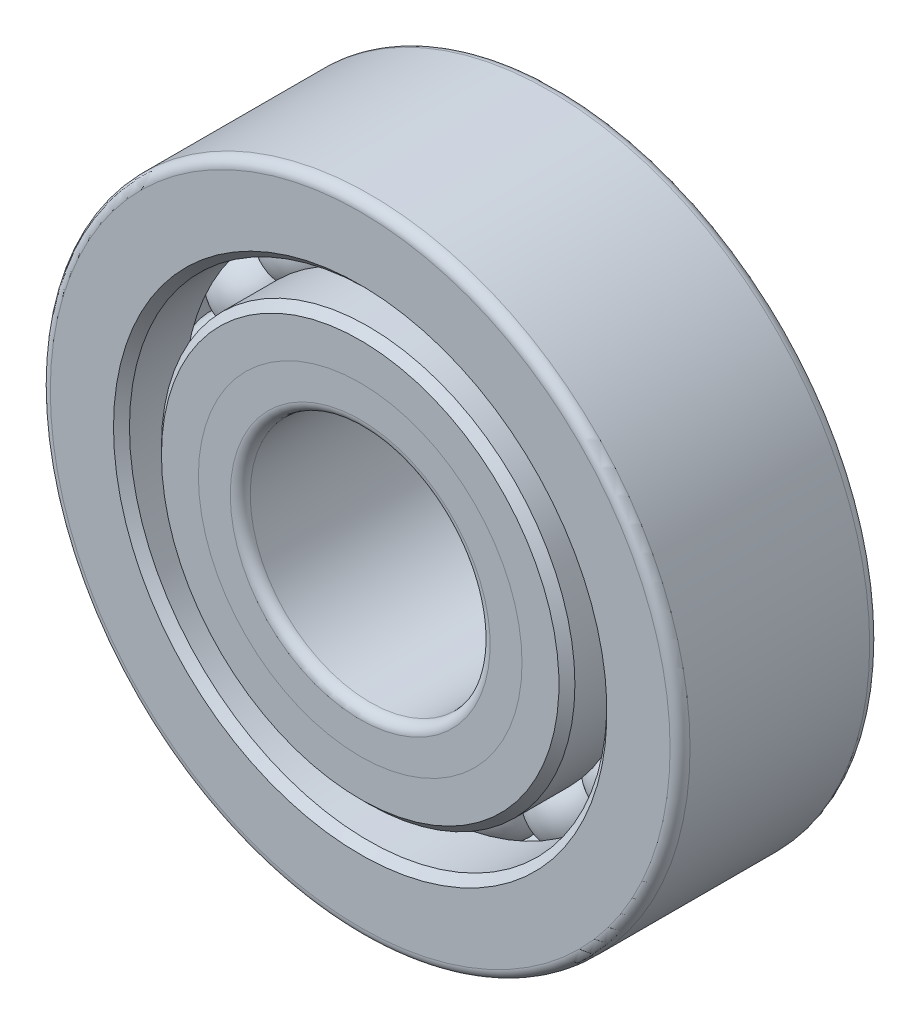
ISO-10303-21;
HEADER;
FILE_DESCRIPTION(('STEP AP214'),'2;1');
FILE_NAME('part.step','',(''),(''),'','','');
FILE_SCHEMA(('AUTOMOTIVE_DESIGN { 1 0 10303 214 1 1 1 1 }'));
ENDSEC;
DATA;
#1=APPLICATION_CONTEXT('core data for automotive mechanical design processes');
#2=APPLICATION_PROTOCOL_DEFINITION('international standard','automotive_design',2000,#1);
#3=PRODUCT_CONTEXT('',#1,'mechanical');
#4=PRODUCT('Part','Part','',(#3));
#5=PRODUCT_RELATED_PRODUCT_CATEGORY('part','',(#4));
#6=PRODUCT_DEFINITION_FORMATION('','',#4);
#7=PRODUCT_DEFINITION_CONTEXT('part definition',#1,'design');
#8=PRODUCT_DEFINITION('design','',#6,#7);
#9=PRODUCT_DEFINITION_SHAPE('','',#8);
#10=(LENGTH_UNIT() NAMED_UNIT(*) SI_UNIT(.MILLI.,.METRE.));
#11=(NAMED_UNIT(*) PLANE_ANGLE_UNIT() SI_UNIT($,.RADIAN.));
#12=(NAMED_UNIT(*) SI_UNIT($,.STERADIAN.) SOLID_ANGLE_UNIT());
#13=UNCERTAINTY_MEASURE_WITH_UNIT(LENGTH_MEASURE(1.E-05),#10,'distance_accuracy_value','');
#14=(GEOMETRIC_REPRESENTATION_CONTEXT(3) GLOBAL_UNCERTAINTY_ASSIGNED_CONTEXT((#13)) GLOBAL_UNIT_ASSIGNED_CONTEXT((#10,
#11,#12)) REPRESENTATION_CONTEXT('',''));
#15=CARTESIAN_POINT('',(0.,0.,0.));
#16=DIRECTION('',(0.,0.,1.));
#17=DIRECTION('',(1.,0.,0.));
#18=AXIS2_PLACEMENT_3D('',#15,#16,#17);
#19=CARTESIAN_POINT('',(0.,0.,-3.9724));
#20=DIRECTION('',(0.,0.,1.));
#21=DIRECTION('',(1.,0.,0.));
#22=AXIS2_PLACEMENT_3D('',#19,#20,#21);
#23=CYLINDRICAL_SURFACE('',#22,6.42450666666667);
#24=CARTESIAN_POINT('',(0.,0.,-3.9624));
#25=DIRECTION('',(0.,0.,1.));
#26=DIRECTION('',(1.,0.,0.));
#27=AXIS2_PLACEMENT_3D('',#24,#25,#26);
#28=CIRCLE('',#27,6.42450666666667);
#29=CARTESIAN_POINT('',(6.42450666666667,0.,-3.9624));
#30=VERTEX_POINT('',#29);
#31=EDGE_CURVE('E57',#30,#30,#28,.T.);
#32=ORIENTED_EDGE('',*,*,#31,.T.);
#33=EDGE_LOOP('',(#32));
#34=FACE_BOUND('',#33,.T.);
#35=CARTESIAN_POINT('',(0.,0.,3.9624));
#36=DIRECTION('',(0.,0.,-1.));
#37=DIRECTION('',(-1.,0.,0.));
#38=AXIS2_PLACEMENT_3D('',#35,#36,#37);
#39=CIRCLE('',#38,6.42450666666667);
#40=CARTESIAN_POINT('',(-6.42450666666667,0.,3.9624));
#41=VERTEX_POINT('',#40);
#42=EDGE_CURVE('E45',#41,#41,#39,.T.);
#43=ORIENTED_EDGE('',*,*,#42,.T.);
#44=EDGE_LOOP('',(#43));
#45=FACE_BOUND('',#44,.T.);
#46=ADVANCED_FACE('F41',(#34,#45),#23,.T.);
#47=CARTESIAN_POINT('',(0.,4.7625,-3.9624));
#48=DIRECTION('',(0.,0.,1.));
#49=DIRECTION('',(1.,0.,0.));
#50=AXIS2_PLACEMENT_3D('',#47,#48,#49);
#51=PLANE('',#50);
#52=CARTESIAN_POINT('',(0.,0.,-3.9624));
#53=DIRECTION('',(0.,0.,1.));
#54=DIRECTION('',(1.,0.,0.));
#55=AXIS2_PLACEMENT_3D('',#52,#53,#54);
#56=CIRCLE('',#55,5.15874);
#57=CARTESIAN_POINT('',(5.15874,0.,-3.9624));
#58=VERTEX_POINT('',#57);
#59=EDGE_CURVE('E11',#58,#58,#56,.T.);
#60=ORIENTED_EDGE('',*,*,#59,.T.);
#61=EDGE_LOOP('',(#60));
#62=FACE_BOUND('',#61,.T.);
#63=ORIENTED_EDGE('',*,*,#31,.F.);
#64=EDGE_LOOP('',(#63));
#65=FACE_BOUND('',#64,.T.);
#66=ADVANCED_FACE('F43',(#62,#65),#51,.F.);
#67=CARTESIAN_POINT('',(0.,8.20801,3.9624));
#68=DIRECTION('',(0.,0.,-1.));
#69=DIRECTION('',(-1.,0.,0.));
#70=AXIS2_PLACEMENT_3D('',#67,#68,#69);
#71=PLANE('',#70);
#72=CARTESIAN_POINT('',(0.,0.,3.9624));
#73=DIRECTION('',(0.,0.,-1.));
#74=DIRECTION('',(-1.,0.,0.));
#75=AXIS2_PLACEMENT_3D('',#72,#73,#74);
#76=CIRCLE('',#75,5.15874);
#77=CARTESIAN_POINT('',(-5.15874,0.,3.9624));
#78=VERTEX_POINT('',#77);
#79=EDGE_CURVE('E59',#78,#78,#76,.T.);
#80=ORIENTED_EDGE('',*,*,#79,.T.);
#81=EDGE_LOOP('',(#80));
#82=FACE_BOUND('',#81,.T.);
#83=ORIENTED_EDGE('',*,*,#42,.F.);
#84=EDGE_LOOP('',(#83));
#85=FACE_BOUND('',#84,.T.);
#86=ADVANCED_FACE('F68',(#82,#85),#71,.F.);
#87=CARTESIAN_POINT('',(0.,0.,3.9624));
#88=DIRECTION('',(0.,0.,1.));
#89=DIRECTION('',(1.,0.,0.));
#90=AXIS2_PLACEMENT_3D('',#87,#88,#89);
#91=CYLINDRICAL_SURFACE('',#90,4.7625);
#92=CARTESIAN_POINT('',(0.,0.,-3.56616));
#93=DIRECTION('',(0.,0.,1.));
#94=DIRECTION('',(1.,0.,0.));
#95=AXIS2_PLACEMENT_3D('',#92,#93,#94);
#96=CIRCLE('',#95,4.7625);
#97=CARTESIAN_POINT('',(4.7625,0.,-3.56616));
#98=VERTEX_POINT('',#97);
#99=EDGE_CURVE('E54',#98,#98,#96,.F.);
#100=ORIENTED_EDGE('',*,*,#99,.T.);
#101=EDGE_LOOP('',(#100));
#102=FACE_BOUND('',#101,.T.);
#103=CARTESIAN_POINT('',(0.,0.,3.56616));
#104=DIRECTION('',(0.,0.,-1.));
#105=DIRECTION('',(-1.,0.,0.));
#106=AXIS2_PLACEMENT_3D('',#103,#104,#105);
#107=CIRCLE('',#106,4.7625);
#108=CARTESIAN_POINT('',(-4.7625,0.,3.56616));
#109=VERTEX_POINT('',#108);
#110=EDGE_CURVE('E49',#109,#109,#107,.F.);
#111=ORIENTED_EDGE('',*,*,#110,.T.);
#112=EDGE_LOOP('',(#111));
#113=FACE_BOUND('',#112,.T.);
#114=ADVANCED_FACE('F70',(#102,#113),#91,.F.);
#115=CARTESIAN_POINT('',(0.,0.,-3.56616));
#116=DIRECTION('',(0.,0.,1.));
#117=DIRECTION('',(1.,0.,0.));
#118=AXIS2_PLACEMENT_3D('',#115,#116,#117);
#119=TOROIDAL_SURFACE('',#118,5.15874,0.39624);
#120=ORIENTED_EDGE('',*,*,#99,.F.);
#121=EDGE_LOOP('',(#120));
#122=FACE_BOUND('',#121,.T.);
#123=ORIENTED_EDGE('',*,*,#59,.F.);
#124=EDGE_LOOP('',(#123));
#125=FACE_BOUND('',#124,.T.);
#126=ADVANCED_FACE('F76',(#122,#125),#119,.T.);
#127=CARTESIAN_POINT('',(0.,0.,3.56616));
#128=DIRECTION('',(0.,0.,-1.));
#129=DIRECTION('',(-1.,0.,0.));
#130=AXIS2_PLACEMENT_3D('',#127,#128,#129);
#131=TOROIDAL_SURFACE('',#130,5.15874,0.39624);
#132=ORIENTED_EDGE('',*,*,#79,.F.);
#133=EDGE_LOOP('',(#132));
#134=FACE_BOUND('',#133,.T.);
#135=ORIENTED_EDGE('',*,*,#110,.F.);
#136=EDGE_LOOP('',(#135));
#137=FACE_BOUND('',#136,.T.);
#138=ADVANCED_FACE('F81',(#134,#137),#131,.T.);
#139=CLOSED_SHELL('',(#46,#66,#86,#114,#126,#138));
#140=MANIFOLD_SOLID_BREP('B2',#139);
#141=CARTESIAN_POINT('',(0.,0.,-3.9724));
#142=DIRECTION('',(0.,0.,1.));
#143=DIRECTION('',(1.,0.,0.));
#144=AXIS2_PLACEMENT_3D('',#141,#142,#143);
#145=CYLINDRICAL_SURFACE('',#144,6.42450666666667);
#146=CARTESIAN_POINT('',(0.,0.,3.9624));
#147=DIRECTION('',(0.,0.,-1.));
#148=DIRECTION('',(-1.,0.,0.));
#149=AXIS2_PLACEMENT_3D('',#146,#147,#148);
#150=CIRCLE('',#149,6.42450666666667);
#151=CARTESIAN_POINT('',(-6.42450666666667,0.,3.9624));
#152=VERTEX_POINT('',#151);
#153=EDGE_CURVE('E144',#152,#152,#150,.T.);
#154=ORIENTED_EDGE('',*,*,#153,.F.);
#155=EDGE_LOOP('',(#154));
#156=FACE_BOUND('',#155,.T.);
#157=CARTESIAN_POINT('',(0.,0.,-3.9624));
#158=DIRECTION('',(0.,0.,1.));
#159=DIRECTION('',(1.,0.,0.));
#160=AXIS2_PLACEMENT_3D('',#157,#158,#159);
#161=CIRCLE('',#160,6.42450666666667);
#162=CARTESIAN_POINT('',(6.42450666666667,0.,-3.9624));
#163=VERTEX_POINT('',#162);
#164=EDGE_CURVE('E40',#163,#163,#161,.T.);
#165=ORIENTED_EDGE('',*,*,#164,.F.);
#166=EDGE_LOOP('',(#165));
#167=FACE_BOUND('',#166,.T.);
#168=ADVANCED_FACE('F138',(#156,#167),#145,.F.);
#169=CARTESIAN_POINT('',(0.,0.,0.));
#170=DIRECTION('',(0.,0.,1.));
#171=DIRECTION('',(1.,0.,0.));
#172=AXIS2_PLACEMENT_3D('',#169,#170,#171);
#173=TOROIDAL_SURFACE('',#172,8.84301,1.5875);
#174=CARTESIAN_POINT('',(0.,0.,-1.45496778314848));
#175=DIRECTION('',(0.,0.,1.));
#176=DIRECTION('',(1.,0.,0.));
#177=AXIS2_PLACEMENT_3D('',#174,#175,#176);
#178=CIRCLE('',#177,8.20801);
#179=CARTESIAN_POINT('',(8.20801,0.,-1.45496778314848));
#180=VERTEX_POINT('',#179);
#181=EDGE_CURVE('E166',#180,#180,#178,.T.);
#182=ORIENTED_EDGE('',*,*,#181,.T.);
#183=EDGE_LOOP('',(#182));
#184=FACE_BOUND('',#183,.T.);
#185=CARTESIAN_POINT('',(0.,0.,1.45496778314848));
#186=DIRECTION('',(0.,0.,-1.));
#187=DIRECTION('',(-1.,0.,0.));
#188=AXIS2_PLACEMENT_3D('',#185,#186,#187);
#189=CIRCLE('',#188,8.20801);
#190=CARTESIAN_POINT('',(-8.20801,0.,1.45496778314848));
#191=VERTEX_POINT('',#190);
#192=EDGE_CURVE('E163',#191,#191,#189,.T.);
#193=ORIENTED_EDGE('',*,*,#192,.T.);
#194=EDGE_LOOP('',(#193));
#195=FACE_BOUND('',#194,.T.);
#196=ADVANCED_FACE('F170',(#184,#195),#173,.F.);
#197=CARTESIAN_POINT('',(0.,0.,3.9624));
#198=DIRECTION('',(0.,0.,1.));
#199=DIRECTION('',(1.,0.,0.));
#200=AXIS2_PLACEMENT_3D('',#197,#198,#199);
#201=CYLINDRICAL_SURFACE('',#200,8.20801);
#202=CARTESIAN_POINT('',(0.,0.,3.645408));
#203=DIRECTION('',(0.,0.,-1.));
#204=DIRECTION('',(-1.,0.,0.));
#205=AXIS2_PLACEMENT_3D('',#202,#203,#204);
#206=CIRCLE('',#205,8.20801);
#207=CARTESIAN_POINT('',(-8.20801,0.,3.645408));
#208=VERTEX_POINT('',#207);
#209=EDGE_CURVE('E148',#208,#208,#206,.T.);
#210=ORIENTED_EDGE('',*,*,#209,.T.);
#211=EDGE_LOOP('',(#210));
#212=FACE_BOUND('',#211,.T.);
#213=ORIENTED_EDGE('',*,*,#192,.F.);
#214=EDGE_LOOP('',(#213));
#215=FACE_BOUND('',#214,.T.);
#216=ADVANCED_FACE('F179',(#212,#215),#201,.T.);
#217=CARTESIAN_POINT('',(0.,0.,3.9624));
#218=DIRECTION('',(0.,0.,-1.));
#219=DIRECTION('',(-1.,0.,0.));
#220=AXIS2_PLACEMENT_3D('',#217,#218,#219);
#221=CONICAL_SURFACE('',#220,7.891018,0.785398163397446);
#222=ORIENTED_EDGE('',*,*,#209,.F.);
#223=EDGE_LOOP('',(#222));
#224=FACE_BOUND('',#223,.T.);
#225=CARTESIAN_POINT('',(0.,0.,3.9624));
#226=DIRECTION('',(0.,0.,-1.));
#227=DIRECTION('',(-1.,0.,0.));
#228=AXIS2_PLACEMENT_3D('',#225,#226,#227);
#229=CIRCLE('',#228,7.891018);
#230=CARTESIAN_POINT('',(-7.891018,0.,3.9624));
#231=VERTEX_POINT('',#230);
#232=EDGE_CURVE('E152',#231,#231,#229,.F.);
#233=ORIENTED_EDGE('',*,*,#232,.F.);
#234=EDGE_LOOP('',(#233));
#235=FACE_BOUND('',#234,.T.);
#236=ADVANCED_FACE('F187',(#224,#235),#221,.T.);
#237=CARTESIAN_POINT('',(0.,8.20801,3.9624));
#238=DIRECTION('',(0.,0.,-1.));
#239=DIRECTION('',(-1.,0.,0.));
#240=AXIS2_PLACEMENT_3D('',#237,#238,#239);
#241=PLANE('',#240);
#242=ORIENTED_EDGE('',*,*,#153,.T.);
#243=EDGE_LOOP('',(#242));
#244=FACE_BOUND('',#243,.T.);
#245=ORIENTED_EDGE('',*,*,#232,.T.);
#246=EDGE_LOOP('',(#245));
#247=FACE_BOUND('',#246,.T.);
#248=ADVANCED_FACE('F176',(#244,#247),#241,.F.);
#249=CARTESIAN_POINT('',(0.,0.,-3.645408));
#250=DIRECTION('',(0.,0.,1.));
#251=DIRECTION('',(1.,0.,0.));
#252=AXIS2_PLACEMENT_3D('',#249,#250,#251);
#253=CIRCLE('',#252,8.20801);
#254=CARTESIAN_POINT('',(8.20801,0.,-3.645408));
#255=VERTEX_POINT('',#254);
#256=EDGE_CURVE('E160',#255,#255,#253,.T.);
#257=ORIENTED_EDGE('',*,*,#256,.T.);
#258=EDGE_LOOP('',(#257));
#259=FACE_BOUND('',#258,.T.);
#260=ORIENTED_EDGE('',*,*,#181,.F.);
#261=EDGE_LOOP('',(#260));
#262=FACE_BOUND('',#261,.T.);
#263=ADVANCED_FACE('F173',(#259,#262),#201,.T.);
#264=CARTESIAN_POINT('',(0.,0.,-3.645408));
#265=DIRECTION('',(0.,0.,1.));
#266=DIRECTION('',(1.,0.,0.));
#267=AXIS2_PLACEMENT_3D('',#264,#265,#266);
#268=CONICAL_SURFACE('',#267,8.20801,0.785398163397446);
#269=CARTESIAN_POINT('',(0.,0.,-3.9624));
#270=DIRECTION('',(0.,0.,1.));
#271=DIRECTION('',(1.,0.,0.));
#272=AXIS2_PLACEMENT_3D('',#269,#270,#271);
#273=CIRCLE('',#272,7.891018);
#274=CARTESIAN_POINT('',(7.891018,0.,-3.9624));
#275=VERTEX_POINT('',#274);
#276=EDGE_CURVE('E157',#275,#275,#273,.F.);
#277=ORIENTED_EDGE('',*,*,#276,.F.);
#278=EDGE_LOOP('',(#277));
#279=FACE_BOUND('',#278,.T.);
#280=ORIENTED_EDGE('',*,*,#256,.F.);
#281=EDGE_LOOP('',(#280));
#282=FACE_BOUND('',#281,.T.);
#283=ADVANCED_FACE('F175',(#279,#282),#268,.T.);
#284=CARTESIAN_POINT('',(0.,4.7625,-3.9624));
#285=DIRECTION('',(0.,0.,1.));
#286=DIRECTION('',(1.,0.,0.));
#287=AXIS2_PLACEMENT_3D('',#284,#285,#286);
#288=PLANE('',#287);
#289=ORIENTED_EDGE('',*,*,#164,.T.);
#290=EDGE_LOOP('',(#289));
#291=FACE_BOUND('',#290,.T.);
#292=ORIENTED_EDGE('',*,*,#276,.T.);
#293=EDGE_LOOP('',(#292));
#294=FACE_BOUND('',#293,.T.);
#295=ADVANCED_FACE('F184',(#291,#294),#288,.F.);
#296=CLOSED_SHELL('',(#168,#196,#216,#236,#248,#263,#283,#295));
#297=MANIFOLD_SOLID_BREP('B6',#296);
#298=CARTESIAN_POINT('',(-3.19446366650955,8.24586124934505,0.));
#299=DIRECTION('',(0.,0.,1.));
#300=DIRECTION('',(-0.361241666187141,0.932472229404361,0.));
#301=AXIS2_PLACEMENT_3D('',#298,#299,#300);
#302=SPHERICAL_SURFACE('',#301,1.5875);
#303=CARTESIAN_POINT('',(-3.19446366650955,8.24586124934505,1.5875));
#304=VERTEX_POINT('',#303);
#305=VERTEX_LOOP('',#304);
#306=FACE_BOUND('',#305,.T.);
#307=ADVANCED_FACE('F264',(#306),#302,.T.);
#308=CLOSED_SHELL('',(#307));
#309=MANIFOLD_SOLID_BREP('B35',#308);
#310=CARTESIAN_POINT('',(-5.95749731372286,6.53506324507153,0.));
#311=DIRECTION('',(0.,0.,1.));
#312=DIRECTION('',(-0.673695643646548,0.739008917220668,0.));
#313=AXIS2_PLACEMENT_3D('',#310,#311,#312);
#314=SPHERICAL_SURFACE('',#313,1.5875);
#315=CARTESIAN_POINT('',(-5.95749731372286,6.53506324507153,1.5875));
#316=VERTEX_POINT('',#315);
#317=VERTEX_LOOP('',#316);
#318=FACE_BOUND('',#317,.T.);
#319=ADVANCED_FACE('F284',(#318),#314,.T.);
#320=CLOSED_SHELL('',(#319));
#321=MANIFOLD_SOLID_BREP('B134',#320);
#322=CARTESIAN_POINT('',(-7.91593793708568,3.94166873751558,0.));
#323=DIRECTION('',(0.,0.,1.));
#324=DIRECTION('',(-0.895163291355057,0.445738355776549,0.));
#325=AXIS2_PLACEMENT_3D('',#322,#323,#324);
#326=SPHERICAL_SURFACE('',#325,1.5875);
#327=CARTESIAN_POINT('',(-7.91593793708568,3.94166873751558,1.5875));
#328=VERTEX_POINT('',#327);
#329=VERTEX_LOOP('',#328);
#330=FACE_BOUND('',#329,.T.);
#331=ADVANCED_FACE('F304',(#330),#326,.T.);
#332=CLOSED_SHELL('',(#331));
#333=MANIFOLD_SOLID_BREP('B260',#332);
#334=CARTESIAN_POINT('',(-8.80528727831874,0.815930025417672,0.));
#335=DIRECTION('',(0.,0.,1.));
#336=DIRECTION('',(-0.995734176295033,0.092268359463313,0.));
#337=AXIS2_PLACEMENT_3D('',#334,#335,#336);
#338=SPHERICAL_SURFACE('',#337,1.5875);
#339=CARTESIAN_POINT('',(-8.80528727831874,0.815930025417672,1.5875));
#340=VERTEX_POINT('',#339);
#341=VERTEX_LOOP('',#340);
#342=FACE_BOUND('',#341,.T.);
#343=ADVANCED_FACE('F324',(#342),#338,.T.);
#344=CLOSED_SHELL('',(#343));
#345=MANIFOLD_SOLID_BREP('B280',#344);
#346=CARTESIAN_POINT('',(-8.5054337808337,-2.42000455783724,0.));
#347=DIRECTION('',(0.,0.,1.));
#348=DIRECTION('',(-0.961825643172822,-0.273662990072073,0.));
#349=AXIS2_PLACEMENT_3D('',#346,#347,#348);
#350=SPHERICAL_SURFACE('',#349,1.5875);
#351=CARTESIAN_POINT('',(-8.5054337808337,-2.42000455783724,1.5875));
#352=VERTEX_POINT('',#351);
#353=VERTEX_LOOP('',#352);
#354=FACE_BOUND('',#353,.T.);
#355=ADVANCED_FACE('F344',(#354),#350,.T.);
#356=CLOSED_SHELL('',(#355));
#357=MANIFOLD_SOLID_BREP('B300',#356);
#358=CARTESIAN_POINT('',(-7.05687432101148,-5.32910411584807,0.));
#359=DIRECTION('',(0.,0.,1.));
#360=DIRECTION('',(-0.798017227280245,-0.602634636379249,0.));
#361=AXIS2_PLACEMENT_3D('',#358,#359,#360);
#362=SPHERICAL_SURFACE('',#361,1.5875);
#363=CARTESIAN_POINT('',(-7.05687432101148,-5.32910411584807,1.5875));
#364=VERTEX_POINT('',#363);
#365=VERTEX_LOOP('',#364);
#366=FACE_BOUND('',#365,.T.);
#367=ADVANCED_FACE('F364',(#366),#362,.T.);
#368=CLOSED_SHELL('',(#367));
#369=MANIFOLD_SOLID_BREP('B320',#368);
#370=CARTESIAN_POINT('',(-4.65524488064615,-7.5184786334283,0.));
#371=DIRECTION('',(0.,0.,1.));
#372=DIRECTION('',(-0.526432162877363,-0.85021713572961,0.));
#373=AXIS2_PLACEMENT_3D('',#370,#371,#372);
#374=SPHERICAL_SURFACE('',#373,1.5875);
#375=CARTESIAN_POINT('',(-4.65524488064615,-7.5184786334283,1.5875));
#376=VERTEX_POINT('',#375);
#377=VERTEX_LOOP('',#376);
#378=FACE_BOUND('',#377,.T.);
#379=ADVANCED_FACE('F384',(#378),#374,.T.);
#380=CLOSED_SHELL('',(#379));
#381=MANIFOLD_SOLID_BREP('B340',#380);
#382=CARTESIAN_POINT('',(-1.62489882354717,-8.69244095023573,0.));
#383=DIRECTION('',(0.,0.,1.));
#384=DIRECTION('',(-0.183749517816578,-0.9829730996839,0.));
#385=AXIS2_PLACEMENT_3D('',#382,#383,#384);
#386=SPHERICAL_SURFACE('',#385,1.5875);
#387=CARTESIAN_POINT('',(-1.62489882354717,-8.69244095023573,1.5875));
#388=VERTEX_POINT('',#387);
#389=VERTEX_LOOP('',#388);
#390=FACE_BOUND('',#389,.T.);
#391=ADVANCED_FACE('F404',(#390),#386,.T.);
#392=CLOSED_SHELL('',(#391));
#393=MANIFOLD_SOLID_BREP('B360',#392);
#394=CARTESIAN_POINT('',(1.62489882354705,-8.69244095023575,0.));
#395=DIRECTION('',(0.,0.,1.));
#396=DIRECTION('',(0.183749517816564,-0.982973099683903,0.));
#397=AXIS2_PLACEMENT_3D('',#394,#395,#396);
#398=SPHERICAL_SURFACE('',#397,1.5875);
#399=CARTESIAN_POINT('',(1.62489882354705,-8.69244095023575,1.5875));
#400=VERTEX_POINT('',#399);
#401=VERTEX_LOOP('',#400);
#402=FACE_BOUND('',#401,.T.);
#403=ADVANCED_FACE('F424',(#402),#398,.T.);
#404=CLOSED_SHELL('',(#403));
#405=MANIFOLD_SOLID_BREP('B380',#404);
#406=CARTESIAN_POINT('',(4.65524488064604,-7.51847863342836,0.));
#407=DIRECTION('',(0.,0.,1.));
#408=DIRECTION('',(0.526432162877351,-0.850217135729617,0.));
#409=AXIS2_PLACEMENT_3D('',#406,#407,#408);
#410=SPHERICAL_SURFACE('',#409,1.5875);
#411=CARTESIAN_POINT('',(4.65524488064604,-7.51847863342836,1.5875));
#412=VERTEX_POINT('',#411);
#413=VERTEX_LOOP('',#412);
#414=FACE_BOUND('',#413,.T.);
#415=ADVANCED_FACE('F444',(#414),#410,.T.);
#416=CLOSED_SHELL('',(#415));
#417=MANIFOLD_SOLID_BREP('B400',#416);
#418=CARTESIAN_POINT('',(7.0568743210114,-5.32910411584816,0.));
#419=DIRECTION('',(0.,0.,1.));
#420=DIRECTION('',(0.798017227280236,-0.602634636379261,0.));
#421=AXIS2_PLACEMENT_3D('',#418,#419,#420);
#422=SPHERICAL_SURFACE('',#421,1.5875);
#423=CARTESIAN_POINT('',(7.0568743210114,-5.32910411584816,1.5875));
#424=VERTEX_POINT('',#423);
#425=VERTEX_LOOP('',#424);
#426=FACE_BOUND('',#425,.T.);
#427=ADVANCED_FACE('F464',(#426),#422,.T.);
#428=CLOSED_SHELL('',(#427));
#429=MANIFOLD_SOLID_BREP('B420',#428);
#430=CARTESIAN_POINT('',(8.50543378083366,-2.42000455783736,0.));
#431=DIRECTION('',(0.,0.,1.));
#432=DIRECTION('',(0.961825643172818,-0.273662990072087,0.));
#433=AXIS2_PLACEMENT_3D('',#430,#431,#432);
#434=SPHERICAL_SURFACE('',#433,1.5875);
#435=CARTESIAN_POINT('',(8.50543378083366,-2.42000455783736,1.5875));
#436=VERTEX_POINT('',#435);
#437=VERTEX_LOOP('',#436);
#438=FACE_BOUND('',#437,.T.);
#439=ADVANCED_FACE('F484',(#438),#434,.T.);
#440=CLOSED_SHELL('',(#439));
#441=MANIFOLD_SOLID_BREP('B440',#440);
#442=CARTESIAN_POINT('',(8.80528727831876,0.815930025417545,0.));
#443=DIRECTION('',(0.,0.,1.));
#444=DIRECTION('',(0.995734176295035,0.0922683594632987,0.));
#445=AXIS2_PLACEMENT_3D('',#442,#443,#444);
#446=SPHERICAL_SURFACE('',#445,1.5875);
#447=CARTESIAN_POINT('',(8.80528727831876,0.815930025417545,1.5875));
#448=VERTEX_POINT('',#447);
#449=VERTEX_LOOP('',#448);
#450=FACE_BOUND('',#449,.T.);
#451=ADVANCED_FACE('F504',(#450),#446,.T.);
#452=CLOSED_SHELL('',(#451));
#453=MANIFOLD_SOLID_BREP('B460',#452);
#454=CARTESIAN_POINT('',(7.91593793708574,3.94166873751547,0.));
#455=DIRECTION('',(0.,0.,1.));
#456=DIRECTION('',(0.895163291355063,0.445738355776536,0.));
#457=AXIS2_PLACEMENT_3D('',#454,#455,#456);
#458=SPHERICAL_SURFACE('',#457,1.5875);
#459=CARTESIAN_POINT('',(7.91593793708574,3.94166873751547,1.5875));
#460=VERTEX_POINT('',#459);
#461=VERTEX_LOOP('',#460);
#462=FACE_BOUND('',#461,.T.);
#463=ADVANCED_FACE('F524',(#462),#458,.T.);
#464=CLOSED_SHELL('',(#463));
#465=MANIFOLD_SOLID_BREP('B480',#464);
#466=CARTESIAN_POINT('',(5.95749731372295,6.53506324507145,0.));
#467=DIRECTION('',(0.,0.,1.));
#468=DIRECTION('',(0.673695643646558,0.739008917220658,0.));
#469=AXIS2_PLACEMENT_3D('',#466,#467,#468);
#470=SPHERICAL_SURFACE('',#469,1.5875);
#471=CARTESIAN_POINT('',(5.95749731372295,6.53506324507145,1.5875));
#472=VERTEX_POINT('',#471);
#473=VERTEX_LOOP('',#472);
#474=FACE_BOUND('',#473,.T.);
#475=ADVANCED_FACE('F544',(#474),#470,.T.);
#476=CLOSED_SHELL('',(#475));
#477=MANIFOLD_SOLID_BREP('B500',#476);
#478=CARTESIAN_POINT('',(3.19446366650966,8.24586124934501,0.));
#479=DIRECTION('',(0.,0.,1.));
#480=DIRECTION('',(0.361241666187154,0.932472229404355,0.));
#481=AXIS2_PLACEMENT_3D('',#478,#479,#480);
#482=SPHERICAL_SURFACE('',#481,1.5875);
#483=CARTESIAN_POINT('',(3.19446366650966,8.24586124934501,1.5875));
#484=VERTEX_POINT('',#483);
#485=VERTEX_LOOP('',#484);
#486=FACE_BOUND('',#485,.T.);
#487=ADVANCED_FACE('F564',(#486),#482,.T.);
#488=CLOSED_SHELL('',(#487));
#489=MANIFOLD_SOLID_BREP('B520',#488);
#490=CARTESIAN_POINT('',(0.,8.84301,0.));
#491=DIRECTION('',(0.,0.,1.));
#492=DIRECTION('',(0.,1.,0.));
#493=AXIS2_PLACEMENT_3D('',#490,#491,#492);
#494=SPHERICAL_SURFACE('',#493,1.5875);
#495=CARTESIAN_POINT('',(0.,8.84301,1.5875));
#496=VERTEX_POINT('',#495);
#497=VERTEX_LOOP('',#496);
#498=FACE_BOUND('',#497,.T.);
#499=ADVANCED_FACE('F585',(#498),#494,.T.);
#500=CLOSED_SHELL('',(#499));
#501=MANIFOLD_SOLID_BREP('B540',#500);
#502=CARTESIAN_POINT('',(0.,0.,3.9624));
#503=DIRECTION('',(0.,0.,1.));
#504=DIRECTION('',(1.,0.,0.));
#505=AXIS2_PLACEMENT_3D('',#502,#503,#504);
#506=CYLINDRICAL_SURFACE('',#505,9.47801);
#507=CARTESIAN_POINT('',(0.,0.,3.64540800000001));
#508=DIRECTION('',(0.,0.,-1.));
#509=DIRECTION('',(-1.,0.,0.));
#510=AXIS2_PLACEMENT_3D('',#507,#508,#509);
#511=CIRCLE('',#510,9.47801);
#512=CARTESIAN_POINT('',(-9.47801,0.,3.64540800000001));
#513=VERTEX_POINT('',#512);
#514=EDGE_CURVE('E604',#513,#513,#511,.F.);
#515=ORIENTED_EDGE('',*,*,#514,.T.);
#516=EDGE_LOOP('',(#515));
#517=FACE_BOUND('',#516,.T.);
#518=CARTESIAN_POINT('',(0.,0.,1.45496778314848));
#519=DIRECTION('',(0.,0.,-1.));
#520=DIRECTION('',(-1.,0.,0.));
#521=AXIS2_PLACEMENT_3D('',#518,#519,#520);
#522=CIRCLE('',#521,9.47801);
#523=CARTESIAN_POINT('',(-9.47801,0.,1.45496778314848));
#524=VERTEX_POINT('',#523);
#525=EDGE_CURVE('E629',#524,#524,#522,.F.);
#526=ORIENTED_EDGE('',*,*,#525,.F.);
#527=EDGE_LOOP('',(#526));
#528=FACE_BOUND('',#527,.T.);
#529=ADVANCED_FACE('F597',(#517,#528),#506,.F.);
#530=CARTESIAN_POINT('',(0.,0.,-3.645408));
#531=DIRECTION('',(0.,0.,1.));
#532=DIRECTION('',(1.,0.,0.));
#533=AXIS2_PLACEMENT_3D('',#530,#531,#532);
#534=CIRCLE('',#533,9.47801);
#535=CARTESIAN_POINT('',(9.47801,0.,-3.645408));
#536=VERTEX_POINT('',#535);
#537=EDGE_CURVE('E608',#536,#536,#534,.F.);
#538=ORIENTED_EDGE('',*,*,#537,.T.);
#539=EDGE_LOOP('',(#538));
#540=FACE_BOUND('',#539,.T.);
#541=CARTESIAN_POINT('',(0.,0.,-1.45496778314848));
#542=DIRECTION('',(0.,0.,1.));
#543=DIRECTION('',(1.,0.,0.));
#544=AXIS2_PLACEMENT_3D('',#541,#542,#543);
#545=CIRCLE('',#544,9.47801);
#546=CARTESIAN_POINT('',(9.47801,0.,-1.45496778314848));
#547=VERTEX_POINT('',#546);
#548=EDGE_CURVE('E632',#547,#547,#545,.F.);
#549=ORIENTED_EDGE('',*,*,#548,.F.);
#550=EDGE_LOOP('',(#549));
#551=FACE_BOUND('',#550,.T.);
#552=ADVANCED_FACE('F639',(#540,#551),#506,.F.);
#553=CARTESIAN_POINT('',(0.,0.,3.9624));
#554=DIRECTION('',(0.,0.,1.));
#555=DIRECTION('',(1.,0.,0.));
#556=AXIS2_PLACEMENT_3D('',#553,#554,#555);
#557=CYLINDRICAL_SURFACE('',#556,12.7);
#558=CARTESIAN_POINT('',(0.,0.,-3.56616));
#559=DIRECTION('',(0.,0.,1.));
#560=DIRECTION('',(1.,0.,0.));
#561=AXIS2_PLACEMENT_3D('',#558,#559,#560);
#562=CIRCLE('',#561,12.7);
#563=CARTESIAN_POINT('',(12.7,0.,-3.56616));
#564=VERTEX_POINT('',#563);
#565=EDGE_CURVE('E623',#564,#564,#562,.T.);
#566=ORIENTED_EDGE('',*,*,#565,.T.);
#567=EDGE_LOOP('',(#566));
#568=FACE_BOUND('',#567,.T.);
#569=CARTESIAN_POINT('',(0.,0.,3.56616));
#570=DIRECTION('',(0.,0.,-1.));
#571=DIRECTION('',(-1.,0.,0.));
#572=AXIS2_PLACEMENT_3D('',#569,#570,#571);
#573=CIRCLE('',#572,12.7);
#574=CARTESIAN_POINT('',(-12.7,0.,3.56616));
#575=VERTEX_POINT('',#574);
#576=EDGE_CURVE('E626',#575,#575,#573,.T.);
#577=ORIENTED_EDGE('',*,*,#576,.T.);
#578=EDGE_LOOP('',(#577));
#579=FACE_BOUND('',#578,.T.);
#580=ADVANCED_FACE('F641',(#568,#579),#557,.T.);
#581=CARTESIAN_POINT('',(0.,12.7,3.9624));
#582=DIRECTION('',(0.,0.,-1.));
#583=DIRECTION('',(-1.,0.,0.));
#584=AXIS2_PLACEMENT_3D('',#581,#582,#583);
#585=PLANE('',#584);
#586=CARTESIAN_POINT('',(0.,0.,3.9624));
#587=DIRECTION('',(0.,0.,-1.));
#588=DIRECTION('',(-1.,0.,0.));
#589=AXIS2_PLACEMENT_3D('',#586,#587,#588);
#590=CIRCLE('',#589,9.79500199999999);
#591=CARTESIAN_POINT('',(-9.79500199999999,0.,3.9624));
#592=VERTEX_POINT('',#591);
#593=EDGE_CURVE('E584',#592,#592,#590,.T.);
#594=ORIENTED_EDGE('',*,*,#593,.T.);
#595=EDGE_LOOP('',(#594));
#596=FACE_BOUND('',#595,.T.);
#597=CARTESIAN_POINT('',(0.,0.,3.9624));
#598=DIRECTION('',(0.,0.,-1.));
#599=DIRECTION('',(-1.,0.,0.));
#600=AXIS2_PLACEMENT_3D('',#597,#598,#599);
#601=CIRCLE('',#600,12.30376);
#602=CARTESIAN_POINT('',(-12.30376,0.,3.9624));
#603=VERTEX_POINT('',#602);
#604=EDGE_CURVE('E617',#603,#603,#601,.F.);
#605=ORIENTED_EDGE('',*,*,#604,.T.);
#606=EDGE_LOOP('',(#605));
#607=FACE_BOUND('',#606,.T.);
#608=ADVANCED_FACE('F648',(#596,#607),#585,.F.);
#609=CARTESIAN_POINT('',(0.,9.47801,-3.9624));
#610=DIRECTION('',(0.,0.,1.));
#611=DIRECTION('',(1.,0.,0.));
#612=AXIS2_PLACEMENT_3D('',#609,#610,#611);
#613=PLANE('',#612);
#614=CARTESIAN_POINT('',(0.,0.,-3.9624));
#615=DIRECTION('',(0.,0.,1.));
#616=DIRECTION('',(1.,0.,0.));
#617=AXIS2_PLACEMENT_3D('',#614,#615,#616);
#618=CIRCLE('',#617,9.795002);
#619=CARTESIAN_POINT('',(9.795002,0.,-3.9624));
#620=VERTEX_POINT('',#619);
#621=EDGE_CURVE('E612',#620,#620,#618,.T.);
#622=ORIENTED_EDGE('',*,*,#621,.T.);
#623=EDGE_LOOP('',(#622));
#624=FACE_BOUND('',#623,.T.);
#625=CARTESIAN_POINT('',(0.,0.,-3.9624));
#626=DIRECTION('',(0.,0.,1.));
#627=DIRECTION('',(1.,0.,0.));
#628=AXIS2_PLACEMENT_3D('',#625,#626,#627);
#629=CIRCLE('',#628,12.30376);
#630=CARTESIAN_POINT('',(12.30376,0.,-3.9624));
#631=VERTEX_POINT('',#630);
#632=EDGE_CURVE('E620',#631,#631,#629,.F.);
#633=ORIENTED_EDGE('',*,*,#632,.T.);
#634=EDGE_LOOP('',(#633));
#635=FACE_BOUND('',#634,.T.);
#636=ADVANCED_FACE('F653',(#624,#635),#613,.F.);
#637=CARTESIAN_POINT('',(0.,0.,0.));
#638=DIRECTION('',(0.,0.,1.));
#639=DIRECTION('',(1.,0.,0.));
#640=AXIS2_PLACEMENT_3D('',#637,#638,#639);
#641=TOROIDAL_SURFACE('',#640,8.84301,1.5875);
#642=ORIENTED_EDGE('',*,*,#548,.T.);
#643=EDGE_LOOP('',(#642));
#644=FACE_BOUND('',#643,.T.);
#645=ORIENTED_EDGE('',*,*,#525,.T.);
#646=EDGE_LOOP('',(#645));
#647=FACE_BOUND('',#646,.T.);
#648=ADVANCED_FACE('F636',(#644,#647),#641,.F.);
#649=CARTESIAN_POINT('',(0.,0.,-3.56616));
#650=DIRECTION('',(0.,0.,1.));
#651=DIRECTION('',(1.,0.,0.));
#652=AXIS2_PLACEMENT_3D('',#649,#650,#651);
#653=TOROIDAL_SURFACE('',#652,12.30376,0.39624);
#654=ORIENTED_EDGE('',*,*,#632,.F.);
#655=EDGE_LOOP('',(#654));
#656=FACE_BOUND('',#655,.T.);
#657=ORIENTED_EDGE('',*,*,#565,.F.);
#658=EDGE_LOOP('',(#657));
#659=FACE_BOUND('',#658,.T.);
#660=ADVANCED_FACE('F657',(#656,#659),#653,.T.);
#661=CARTESIAN_POINT('',(0.,0.,3.56616));
#662=DIRECTION('',(0.,0.,-1.));
#663=DIRECTION('',(-1.,0.,0.));
#664=AXIS2_PLACEMENT_3D('',#661,#662,#663);
#665=TOROIDAL_SURFACE('',#664,12.30376,0.39624);
#666=ORIENTED_EDGE('',*,*,#576,.F.);
#667=EDGE_LOOP('',(#666));
#668=FACE_BOUND('',#667,.T.);
#669=ORIENTED_EDGE('',*,*,#604,.F.);
#670=EDGE_LOOP('',(#669));
#671=FACE_BOUND('',#670,.T.);
#672=ADVANCED_FACE('F660',(#668,#671),#665,.T.);
#673=CARTESIAN_POINT('',(0.,0.,-3.9624));
#674=DIRECTION('',(0.,0.,-1.));
#675=DIRECTION('',(-1.,0.,0.));
#676=AXIS2_PLACEMENT_3D('',#673,#674,#675);
#677=CONICAL_SURFACE('',#676,9.795002,0.785398163397446);
#678=ORIENTED_EDGE('',*,*,#537,.F.);
#679=EDGE_LOOP('',(#678));
#680=FACE_BOUND('',#679,.T.);
#681=ORIENTED_EDGE('',*,*,#621,.F.);
#682=EDGE_LOOP('',(#681));
#683=FACE_BOUND('',#682,.T.);
#684=ADVANCED_FACE('F663',(#680,#683),#677,.F.);
#685=CARTESIAN_POINT('',(0.,0.,3.64540800000001));
#686=DIRECTION('',(0.,0.,1.));
#687=DIRECTION('',(1.,0.,0.));
#688=AXIS2_PLACEMENT_3D('',#685,#686,#687);
#689=CONICAL_SURFACE('',#688,9.47801,0.785398163397454);
#690=ORIENTED_EDGE('',*,*,#593,.F.);
#691=EDGE_LOOP('',(#690));
#692=FACE_BOUND('',#691,.T.);
#693=ORIENTED_EDGE('',*,*,#514,.F.);
#694=EDGE_LOOP('',(#693));
#695=FACE_BOUND('',#694,.T.);
#696=ADVANCED_FACE('F599',(#692,#695),#689,.F.);
#697=CLOSED_SHELL('',(#529,#552,#580,#608,#636,#648,#660,#672,#684,#696));
#698=MANIFOLD_SOLID_BREP('B560',#697);
#699=ADVANCED_BREP_SHAPE_REPRESENTATION('',(#18,#140,#297,#309,#321,#333,#345,#357,#369,#381,
#393,#405,#417,#429,#441,#453,#465,#477,#489,#501,#698),#14);
#700=SHAPE_DEFINITION_REPRESENTATION(#9,#699);
ENDSEC;
END-ISO-10303-21;
